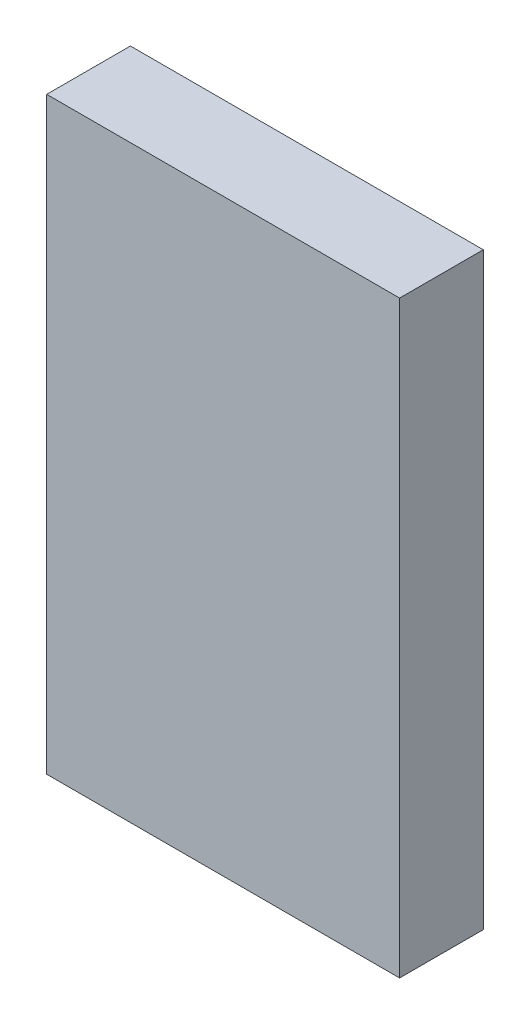
ISO-10303-21;
HEADER;
FILE_DESCRIPTION(('STEP AP214'),'2;1');
FILE_NAME('part.step','',(''),(''),'','','');
FILE_SCHEMA(('AUTOMOTIVE_DESIGN { 1 0 10303 214 1 1 1 1 }'));
ENDSEC;
DATA;
#1=APPLICATION_CONTEXT('core data for automotive mechanical design processes');
#2=APPLICATION_PROTOCOL_DEFINITION('international standard','automotive_design',2000,#1);
#3=PRODUCT_CONTEXT('',#1,'mechanical');
#4=PRODUCT('Part','Part','',(#3));
#5=PRODUCT_RELATED_PRODUCT_CATEGORY('part','',(#4));
#6=PRODUCT_DEFINITION_FORMATION('','',#4);
#7=PRODUCT_DEFINITION_CONTEXT('part definition',#1,'design');
#8=PRODUCT_DEFINITION('design','',#6,#7);
#9=PRODUCT_DEFINITION_SHAPE('','',#8);
#10=(LENGTH_UNIT() NAMED_UNIT(*) SI_UNIT(.MILLI.,.METRE.));
#11=(NAMED_UNIT(*) PLANE_ANGLE_UNIT() SI_UNIT($,.RADIAN.));
#12=(NAMED_UNIT(*) SI_UNIT($,.STERADIAN.) SOLID_ANGLE_UNIT());
#13=UNCERTAINTY_MEASURE_WITH_UNIT(LENGTH_MEASURE(1.E-05),#10,'distance_accuracy_value','');
#14=(GEOMETRIC_REPRESENTATION_CONTEXT(3) GLOBAL_UNCERTAINTY_ASSIGNED_CONTEXT((#13)) GLOBAL_UNIT_ASSIGNED_CONTEXT((#10,
#11,#12)) REPRESENTATION_CONTEXT('',''));
#15=CARTESIAN_POINT('',(0.,0.,0.));
#16=DIRECTION('',(0.,0.,1.));
#17=DIRECTION('',(1.,0.,0.));
#18=AXIS2_PLACEMENT_3D('',#15,#16,#17);
#19=CARTESIAN_POINT('',(-10.541,17.58950254,5.00000016));
#20=DIRECTION('',(0.,0.,1.));
#21=DIRECTION('',(1.,0.,0.));
#22=AXIS2_PLACEMENT_3D('',#19,#20,#21);
#23=PLANE('',#22);
#24=DIRECTION('',(0.,1.,0.));
#25=VECTOR('',#24,1.);
#26=CARTESIAN_POINT('',(10.541,17.58950254,5.00000016));
#27=LINE('',#26,#25);
#28=CARTESIAN_POINT('',(10.541,17.58950254,5.00000016));
#29=VERTEX_POINT('',#28);
#30=CARTESIAN_POINT('',(10.541,-17.58950254,5.00000016));
#31=VERTEX_POINT('',#30);
#32=EDGE_CURVE('E53',#29,#31,#27,.F.);
#33=ORIENTED_EDGE('',*,*,#32,.F.);
#34=DIRECTION('',(1.,0.,0.));
#35=VECTOR('',#34,1.);
#36=CARTESIAN_POINT('',(-10.541,17.58950254,5.00000016));
#37=LINE('',#36,#35);
#38=CARTESIAN_POINT('',(-10.541,17.58950254,5.00000016));
#39=VERTEX_POINT('',#38);
#40=EDGE_CURVE('E68',#39,#29,#37,.T.);
#41=ORIENTED_EDGE('',*,*,#40,.F.);
#42=DIRECTION('',(0.,1.,0.));
#43=VECTOR('',#42,1.);
#44=CARTESIAN_POINT('',(-10.541,-17.58950254,5.00000016));
#45=LINE('',#44,#43);
#46=CARTESIAN_POINT('',(-10.541,-17.58950254,5.00000016));
#47=VERTEX_POINT('',#46);
#48=EDGE_CURVE('E20',#47,#39,#45,.T.);
#49=ORIENTED_EDGE('',*,*,#48,.F.);
#50=DIRECTION('',(1.,0.,0.));
#51=VECTOR('',#50,1.);
#52=CARTESIAN_POINT('',(10.541,-17.58950254,5.00000016));
#53=LINE('',#52,#51);
#54=EDGE_CURVE('E58',#31,#47,#53,.F.);
#55=ORIENTED_EDGE('',*,*,#54,.F.);
#56=EDGE_LOOP('',(#33,#41,#49,#55));
#57=FACE_BOUND('',#56,.T.);
#58=ADVANCED_FACE('F17',(#57),#23,.T.);
#59=CARTESIAN_POINT('',(-10.541,-17.58950254,0.));
#60=DIRECTION('',(-1.,0.,0.));
#61=DIRECTION('',(0.,0.,1.));
#62=AXIS2_PLACEMENT_3D('',#59,#60,#61);
#63=PLANE('',#62);
#64=DIRECTION('',(0.,0.,1.));
#65=VECTOR('',#64,1.);
#66=CARTESIAN_POINT('',(-10.541,17.58950254,0.));
#67=LINE('',#66,#65);
#68=CARTESIAN_POINT('',(-10.541,17.58950254,0.));
#69=VERTEX_POINT('',#68);
#70=EDGE_CURVE('E79',#69,#39,#67,.T.);
#71=ORIENTED_EDGE('',*,*,#70,.F.);
#72=DIRECTION('',(0.,1.,0.));
#73=VECTOR('',#72,1.);
#74=CARTESIAN_POINT('',(-10.541,17.58950254,0.));
#75=LINE('',#74,#73);
#76=CARTESIAN_POINT('',(-10.541,-17.58950254,0.));
#77=VERTEX_POINT('',#76);
#78=EDGE_CURVE('E74',#69,#77,#75,.F.);
#79=ORIENTED_EDGE('',*,*,#78,.T.);
#80=DIRECTION('',(0.,0.,-1.));
#81=VECTOR('',#80,1.);
#82=CARTESIAN_POINT('',(-10.541,-17.58950254,0.));
#83=LINE('',#82,#81);
#84=EDGE_CURVE('E63',#47,#77,#83,.T.);
#85=ORIENTED_EDGE('',*,*,#84,.F.);
#86=ORIENTED_EDGE('',*,*,#48,.T.);
#87=EDGE_LOOP('',(#71,#79,#85,#86));
#88=FACE_BOUND('',#87,.T.);
#89=ADVANCED_FACE('F73',(#88),#63,.T.);
#90=CARTESIAN_POINT('',(10.541,-17.58950254,0.));
#91=DIRECTION('',(0.,-1.,0.));
#92=DIRECTION('',(0.,0.,-1.));
#93=AXIS2_PLACEMENT_3D('',#90,#91,#92);
#94=PLANE('',#93);
#95=ORIENTED_EDGE('',*,*,#84,.T.);
#96=DIRECTION('',(1.,0.,0.));
#97=VECTOR('',#96,1.);
#98=CARTESIAN_POINT('',(-10.541,-17.58950254,0.));
#99=LINE('',#98,#97);
#100=CARTESIAN_POINT('',(10.541,-17.58950254,0.));
#101=VERTEX_POINT('',#100);
#102=EDGE_CURVE('E84',#77,#101,#99,.T.);
#103=ORIENTED_EDGE('',*,*,#102,.T.);
#104=DIRECTION('',(0.,0.,-1.));
#105=VECTOR('',#104,1.);
#106=CARTESIAN_POINT('',(10.541,-17.58950254,0.));
#107=LINE('',#106,#105);
#108=EDGE_CURVE('E65',#31,#101,#107,.T.);
#109=ORIENTED_EDGE('',*,*,#108,.F.);
#110=ORIENTED_EDGE('',*,*,#54,.T.);
#111=EDGE_LOOP('',(#95,#103,#109,#110));
#112=FACE_BOUND('',#111,.T.);
#113=ADVANCED_FACE('F60',(#112),#94,.T.);
#114=CARTESIAN_POINT('',(10.541,17.58950254,0.));
#115=DIRECTION('',(1.,0.,0.));
#116=DIRECTION('',(0.,0.,-1.));
#117=AXIS2_PLACEMENT_3D('',#114,#115,#116);
#118=PLANE('',#117);
#119=ORIENTED_EDGE('',*,*,#108,.T.);
#120=DIRECTION('',(0.,1.,0.));
#121=VECTOR('',#120,1.);
#122=CARTESIAN_POINT('',(10.541,17.58950254,0.));
#123=LINE('',#122,#121);
#124=CARTESIAN_POINT('',(10.541,17.58950254,0.));
#125=VERTEX_POINT('',#124);
#126=EDGE_CURVE('E26',#101,#125,#123,.T.);
#127=ORIENTED_EDGE('',*,*,#126,.T.);
#128=DIRECTION('',(0.,0.,1.));
#129=VECTOR('',#128,1.);
#130=CARTESIAN_POINT('',(10.541,17.58950254,0.));
#131=LINE('',#130,#129);
#132=EDGE_CURVE('E34',#29,#125,#131,.F.);
#133=ORIENTED_EDGE('',*,*,#132,.F.);
#134=ORIENTED_EDGE('',*,*,#32,.T.);
#135=EDGE_LOOP('',(#119,#127,#133,#134));
#136=FACE_BOUND('',#135,.T.);
#137=ADVANCED_FACE('F88',(#136),#118,.T.);
#138=CARTESIAN_POINT('',(-10.541,17.58950254,0.));
#139=DIRECTION('',(0.,1.,0.));
#140=DIRECTION('',(0.,0.,1.));
#141=AXIS2_PLACEMENT_3D('',#138,#139,#140);
#142=PLANE('',#141);
#143=ORIENTED_EDGE('',*,*,#132,.T.);
#144=DIRECTION('',(1.,0.,0.));
#145=VECTOR('',#144,1.);
#146=CARTESIAN_POINT('',(-10.541,17.58950254,0.));
#147=LINE('',#146,#145);
#148=EDGE_CURVE('E11',#125,#69,#147,.F.);
#149=ORIENTED_EDGE('',*,*,#148,.T.);
#150=ORIENTED_EDGE('',*,*,#70,.T.);
#151=ORIENTED_EDGE('',*,*,#40,.T.);
#152=EDGE_LOOP('',(#143,#149,#150,#151));
#153=FACE_BOUND('',#152,.T.);
#154=ADVANCED_FACE('F91',(#153),#142,.T.);
#155=CARTESIAN_POINT('',(-10.541,17.58950254,0.));
#156=DIRECTION('',(0.,0.,1.));
#157=DIRECTION('',(1.,0.,0.));
#158=AXIS2_PLACEMENT_3D('',#155,#156,#157);
#159=PLANE('',#158);
#160=ORIENTED_EDGE('',*,*,#126,.F.);
#161=ORIENTED_EDGE('',*,*,#102,.F.);
#162=ORIENTED_EDGE('',*,*,#78,.F.);
#163=ORIENTED_EDGE('',*,*,#148,.F.);
#164=EDGE_LOOP('',(#160,#161,#162,#163));
#165=FACE_BOUND('',#164,.T.);
#166=ADVANCED_FACE('F90',(#165),#159,.F.);
#167=CLOSED_SHELL('',(#58,#89,#113,#137,#154,#166));
#168=MANIFOLD_SOLID_BREP('B1',#167);
#169=ADVANCED_BREP_SHAPE_REPRESENTATION('',(#18,#168),#14);
#170=SHAPE_DEFINITION_REPRESENTATION(#9,#169);
ENDSEC;
END-ISO-10303-21;
